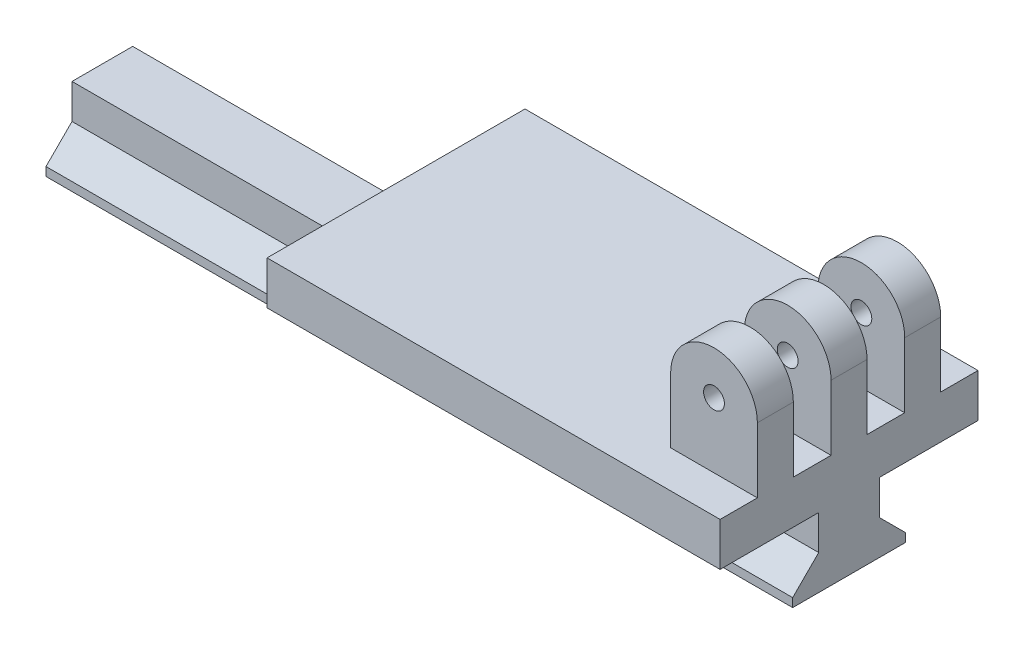
ISO-10303-21;
HEADER;
FILE_DESCRIPTION(('STEP AP214'),'2;1');
FILE_NAME('part.step','',(''),(''),'','','');
FILE_SCHEMA(('AUTOMOTIVE_DESIGN { 1 0 10303 214 1 1 1 1 }'));
ENDSEC;
DATA;
#1=APPLICATION_CONTEXT('core data for automotive mechanical design processes');
#2=APPLICATION_PROTOCOL_DEFINITION('international standard','automotive_design',2000,#1);
#3=PRODUCT_CONTEXT('',#1,'mechanical');
#4=PRODUCT('Part','Part','',(#3));
#5=PRODUCT_RELATED_PRODUCT_CATEGORY('part','',(#4));
#6=PRODUCT_DEFINITION_FORMATION('','',#4);
#7=PRODUCT_DEFINITION_CONTEXT('part definition',#1,'design');
#8=PRODUCT_DEFINITION('design','',#6,#7);
#9=PRODUCT_DEFINITION_SHAPE('','',#8);
#10=(LENGTH_UNIT() NAMED_UNIT(*) SI_UNIT(.MILLI.,.METRE.));
#11=(NAMED_UNIT(*) PLANE_ANGLE_UNIT() SI_UNIT($,.RADIAN.));
#12=(NAMED_UNIT(*) SI_UNIT($,.STERADIAN.) SOLID_ANGLE_UNIT());
#13=UNCERTAINTY_MEASURE_WITH_UNIT(LENGTH_MEASURE(1.E-05),#10,'distance_accuracy_value','');
#14=(GEOMETRIC_REPRESENTATION_CONTEXT(3) GLOBAL_UNCERTAINTY_ASSIGNED_CONTEXT((#13)) GLOBAL_UNIT_ASSIGNED_CONTEXT((#10,
#11,#12)) REPRESENTATION_CONTEXT('',''));
#15=CARTESIAN_POINT('',(0.,0.,0.));
#16=DIRECTION('',(0.,0.,1.));
#17=DIRECTION('',(1.,0.,0.));
#18=AXIS2_PLACEMENT_3D('',#15,#16,#17);
#19=CARTESIAN_POINT('',(0.,0.,0.));
#20=DIRECTION('',(0.,1.,0.));
#21=DIRECTION('',(0.,0.,1.));
#22=AXIS2_PLACEMENT_3D('',#19,#20,#21);
#23=PLANE('',#22);
#24=DIRECTION('',(1.,0.,0.));
#25=VECTOR('',#24,1.);
#26=CARTESIAN_POINT('',(-120.,0.,-7.));
#27=LINE('',#26,#25);
#28=CARTESIAN_POINT('',(-52.25,0.,-7.));
#29=VERTEX_POINT('',#28);
#30=CARTESIAN_POINT('',(52.25,0.,-7.));
#31=VERTEX_POINT('',#30);
#32=EDGE_CURVE('E50',#29,#31,#27,.T.);
#33=ORIENTED_EDGE('',*,*,#32,.F.);
#34=DIRECTION('',(0.,0.,1.));
#35=VECTOR('',#34,1.);
#36=CARTESIAN_POINT('',(-52.25,0.,-29.75));
#37=LINE('',#36,#35);
#38=CARTESIAN_POINT('',(-52.25,0.,-29.75));
#39=VERTEX_POINT('',#38);
#40=EDGE_CURVE('E372',#39,#29,#37,.T.);
#41=ORIENTED_EDGE('',*,*,#40,.F.);
#42=DIRECTION('',(-1.,0.,0.));
#43=VECTOR('',#42,1.);
#44=CARTESIAN_POINT('',(-52.25,0.,-29.75));
#45=LINE('',#44,#43);
#46=CARTESIAN_POINT('',(52.25,0.,-29.75));
#47=VERTEX_POINT('',#46);
#48=EDGE_CURVE('E369',#47,#39,#45,.T.);
#49=ORIENTED_EDGE('',*,*,#48,.F.);
#50=DIRECTION('',(0.,0.,-1.));
#51=VECTOR('',#50,1.);
#52=CARTESIAN_POINT('',(52.25,0.,-29.75));
#53=LINE('',#52,#51);
#54=EDGE_CURVE('E370',#31,#47,#53,.T.);
#55=ORIENTED_EDGE('',*,*,#54,.F.);
#56=EDGE_LOOP('',(#33,#41,#49,#55));
#57=FACE_BOUND('',#56,.T.);
#58=ADVANCED_FACE('F41',(#57),#23,.F.);
#59=CARTESIAN_POINT('',(52.25,10.,-29.75));
#60=DIRECTION('',(-1.,0.,0.));
#61=DIRECTION('',(0.,0.,1.));
#62=AXIS2_PLACEMENT_3D('',#59,#60,#61);
#63=PLANE('',#62);
#64=DIRECTION('',(0.,-1.,0.));
#65=VECTOR('',#64,1.);
#66=CARTESIAN_POINT('',(52.25,35.,-21.15));
#67=LINE('',#66,#65);
#68=CARTESIAN_POINT('',(52.25,25.,-21.15));
#69=VERTEX_POINT('',#68);
#70=CARTESIAN_POINT('',(52.25,10.,-21.15));
#71=VERTEX_POINT('',#70);
#72=EDGE_CURVE('E294',#69,#71,#67,.T.);
#73=ORIENTED_EDGE('',*,*,#72,.F.);
#74=DIRECTION('',(0.,0.,-1.));
#75=VECTOR('',#74,1.);
#76=CARTESIAN_POINT('',(52.25,25.,61.7656211871642));
#77=LINE('',#76,#75);
#78=CARTESIAN_POINT('',(52.25,25.,-12.85));
#79=VERTEX_POINT('',#78);
#80=EDGE_CURVE('E353',#79,#69,#77,.T.);
#81=ORIENTED_EDGE('',*,*,#80,.F.);
#82=DIRECTION('',(0.,-1.,0.));
#83=VECTOR('',#82,1.);
#84=CARTESIAN_POINT('',(52.25,35.,-12.85));
#85=LINE('',#84,#83);
#86=CARTESIAN_POINT('',(52.25,10.,-12.85));
#87=VERTEX_POINT('',#86);
#88=EDGE_CURVE('E306',#79,#87,#85,.T.);
#89=ORIENTED_EDGE('',*,*,#88,.T.);
#90=DIRECTION('',(0.,0.,-1.));
#91=VECTOR('',#90,1.);
#92=CARTESIAN_POINT('',(52.25,10.,-12.85));
#93=LINE('',#92,#91);
#94=CARTESIAN_POINT('',(52.25,10.,-4.15));
#95=VERTEX_POINT('',#94);
#96=EDGE_CURVE('E314',#95,#87,#93,.T.);
#97=ORIENTED_EDGE('',*,*,#96,.F.);
#98=DIRECTION('',(0.,-1.,0.));
#99=VECTOR('',#98,1.);
#100=CARTESIAN_POINT('',(52.25,35.,-4.15));
#101=LINE('',#100,#99);
#102=CARTESIAN_POINT('',(52.25,25.,-4.15));
#103=VERTEX_POINT('',#102);
#104=EDGE_CURVE('E303',#103,#95,#101,.T.);
#105=ORIENTED_EDGE('',*,*,#104,.F.);
#106=CARTESIAN_POINT('',(52.25,25.,4.15));
#107=VERTEX_POINT('',#106);
#108=EDGE_CURVE('E356',#107,#103,#77,.T.);
#109=ORIENTED_EDGE('',*,*,#108,.F.);
#110=DIRECTION('',(0.,-1.,0.));
#111=VECTOR('',#110,1.);
#112=CARTESIAN_POINT('',(52.25,35.,4.15));
#113=LINE('',#112,#111);
#114=CARTESIAN_POINT('',(52.25,10.,4.15));
#115=VERTEX_POINT('',#114);
#116=EDGE_CURVE('E324',#107,#115,#113,.T.);
#117=ORIENTED_EDGE('',*,*,#116,.T.);
#118=DIRECTION('',(0.,0.,-1.));
#119=VECTOR('',#118,1.);
#120=CARTESIAN_POINT('',(52.25,10.,4.15));
#121=LINE('',#120,#119);
#122=CARTESIAN_POINT('',(52.25,10.,12.85));
#123=VERTEX_POINT('',#122);
#124=EDGE_CURVE('E332',#123,#115,#121,.T.);
#125=ORIENTED_EDGE('',*,*,#124,.F.);
#126=DIRECTION('',(0.,-1.,0.));
#127=VECTOR('',#126,1.);
#128=CARTESIAN_POINT('',(52.25,35.,12.85));
#129=LINE('',#128,#127);
#130=CARTESIAN_POINT('',(52.25,25.,12.85));
#131=VERTEX_POINT('',#130);
#132=EDGE_CURVE('E321',#131,#123,#129,.T.);
#133=ORIENTED_EDGE('',*,*,#132,.F.);
#134=CARTESIAN_POINT('',(52.25,25.,21.15));
#135=VERTEX_POINT('',#134);
#136=EDGE_CURVE('E357',#135,#131,#77,.T.);
#137=ORIENTED_EDGE('',*,*,#136,.F.);
#138=DIRECTION('',(0.,-1.,0.));
#139=VECTOR('',#138,1.);
#140=CARTESIAN_POINT('',(52.25,35.,21.15));
#141=LINE('',#140,#139);
#142=CARTESIAN_POINT('',(52.25,10.,21.15));
#143=VERTEX_POINT('',#142);
#144=EDGE_CURVE('E286',#135,#143,#141,.T.);
#145=ORIENTED_EDGE('',*,*,#144,.T.);
#146=DIRECTION('',(0.,0.,-1.));
#147=VECTOR('',#146,1.);
#148=CARTESIAN_POINT('',(52.25,10.,21.15));
#149=LINE('',#148,#147);
#150=CARTESIAN_POINT('',(52.25,10.,29.75));
#151=VERTEX_POINT('',#150);
#152=EDGE_CURVE('E322',#151,#143,#149,.T.);
#153=ORIENTED_EDGE('',*,*,#152,.F.);
#154=DIRECTION('',(0.,-1.,0.));
#155=VECTOR('',#154,1.);
#156=CARTESIAN_POINT('',(52.25,10.,29.75));
#157=LINE('',#156,#155);
#158=CARTESIAN_POINT('',(52.25,0.,29.75));
#159=VERTEX_POINT('',#158);
#160=EDGE_CURVE('E365',#151,#159,#157,.T.);
#161=ORIENTED_EDGE('',*,*,#160,.T.);
#162=CARTESIAN_POINT('',(52.25,0.,7.));
#163=VERTEX_POINT('',#162);
#164=EDGE_CURVE('E366',#159,#163,#53,.T.);
#165=ORIENTED_EDGE('',*,*,#164,.T.);
#166=DIRECTION('',(0.,1.,0.));
#167=VECTOR('',#166,1.);
#168=CARTESIAN_POINT('',(52.25,0.,7.));
#169=LINE('',#168,#167);
#170=CARTESIAN_POINT('',(52.25,-8.,7.));
#171=VERTEX_POINT('',#170);
#172=EDGE_CURVE('E237',#171,#163,#169,.T.);
#173=ORIENTED_EDGE('',*,*,#172,.F.);
#174=DIRECTION('',(0.,0.707106781186548,-0.707106781186547));
#175=VECTOR('',#174,1.);
#176=CARTESIAN_POINT('',(52.25,-8.,7.));
#177=LINE('',#176,#175);
#178=CARTESIAN_POINT('',(52.25,-14.,13.));
#179=VERTEX_POINT('',#178);
#180=EDGE_CURVE('E748',#179,#171,#177,.T.);
#181=ORIENTED_EDGE('',*,*,#180,.F.);
#182=DIRECTION('',(0.,1.,0.));
#183=VECTOR('',#182,1.);
#184=CARTESIAN_POINT('',(52.25,-14.,13.));
#185=LINE('',#184,#183);
#186=CARTESIAN_POINT('',(52.25,-16.,13.));
#187=VERTEX_POINT('',#186);
#188=EDGE_CURVE('E751',#187,#179,#185,.T.);
#189=ORIENTED_EDGE('',*,*,#188,.F.);
#190=DIRECTION('',(0.,0.,1.));
#191=VECTOR('',#190,1.);
#192=CARTESIAN_POINT('',(52.25,-16.,13.));
#193=LINE('',#192,#191);
#194=CARTESIAN_POINT('',(52.25,-16.,-13.));
#195=VERTEX_POINT('',#194);
#196=EDGE_CURVE('E753',#195,#187,#193,.T.);
#197=ORIENTED_EDGE('',*,*,#196,.F.);
#198=DIRECTION('',(0.,-1.,0.));
#199=VECTOR('',#198,1.);
#200=CARTESIAN_POINT('',(52.25,-16.,-13.));
#201=LINE('',#200,#199);
#202=CARTESIAN_POINT('',(52.25,-14.,-13.));
#203=VERTEX_POINT('',#202);
#204=EDGE_CURVE('E230',#203,#195,#201,.T.);
#205=ORIENTED_EDGE('',*,*,#204,.F.);
#206=DIRECTION('',(0.,-0.707106781186548,-0.707106781186547));
#207=VECTOR('',#206,1.);
#208=CARTESIAN_POINT('',(52.25,-14.,-13.));
#209=LINE('',#208,#207);
#210=CARTESIAN_POINT('',(52.25,-8.,-7.));
#211=VERTEX_POINT('',#210);
#212=EDGE_CURVE('E213',#211,#203,#209,.T.);
#213=ORIENTED_EDGE('',*,*,#212,.F.);
#214=DIRECTION('',(0.,-1.,0.));
#215=VECTOR('',#214,1.);
#216=CARTESIAN_POINT('',(52.25,-8.,-7.));
#217=LINE('',#216,#215);
#218=EDGE_CURVE('E227',#31,#211,#217,.T.);
#219=ORIENTED_EDGE('',*,*,#218,.F.);
#220=ORIENTED_EDGE('',*,*,#54,.T.);
#221=DIRECTION('',(0.,-1.,0.));
#222=VECTOR('',#221,1.);
#223=CARTESIAN_POINT('',(52.25,10.,-29.75));
#224=LINE('',#223,#222);
#225=CARTESIAN_POINT('',(52.25,10.,-29.75));
#226=VERTEX_POINT('',#225);
#227=EDGE_CURVE('E384',#226,#47,#224,.T.);
#228=ORIENTED_EDGE('',*,*,#227,.F.);
#229=DIRECTION('',(0.,0.,-1.));
#230=VECTOR('',#229,1.);
#231=CARTESIAN_POINT('',(52.25,10.,-29.75));
#232=LINE('',#231,#230);
#233=EDGE_CURVE('E290',#71,#226,#232,.T.);
#234=ORIENTED_EDGE('',*,*,#233,.F.);
#235=EDGE_LOOP('',(#73,#81,#89,#97,#105,#109,#117,#125,#133,#137,#145,#153,#161,#165,#173,#181,
#189,#197,#205,#213,#219,#220,#228,#234));
#236=FACE_BOUND('',#235,.T.);
#237=ADVANCED_FACE('F43',(#236),#63,.F.);
#238=CARTESIAN_POINT('',(-52.25,10.,-29.75));
#239=DIRECTION('',(0.,0.,1.));
#240=DIRECTION('',(1.,0.,0.));
#241=AXIS2_PLACEMENT_3D('',#238,#239,#240);
#242=PLANE('',#241);
#243=DIRECTION('',(-1.,0.,0.));
#244=VECTOR('',#243,1.);
#245=CARTESIAN_POINT('',(-52.25,10.,-29.75));
#246=LINE('',#245,#244);
#247=CARTESIAN_POINT('',(-52.25,10.,-29.75));
#248=VERTEX_POINT('',#247);
#249=EDGE_CURVE('E358',#226,#248,#246,.T.);
#250=ORIENTED_EDGE('',*,*,#249,.F.);
#251=ORIENTED_EDGE('',*,*,#227,.T.);
#252=ORIENTED_EDGE('',*,*,#48,.T.);
#253=DIRECTION('',(0.,-1.,0.));
#254=VECTOR('',#253,1.);
#255=CARTESIAN_POINT('',(-52.25,10.,-29.75));
#256=LINE('',#255,#254);
#257=EDGE_CURVE('E381',#248,#39,#256,.T.);
#258=ORIENTED_EDGE('',*,*,#257,.F.);
#259=EDGE_LOOP('',(#250,#251,#252,#258));
#260=FACE_BOUND('',#259,.T.);
#261=ADVANCED_FACE('F453',(#260),#242,.F.);
#262=CARTESIAN_POINT('',(-52.25,10.,29.75));
#263=DIRECTION('',(0.,0.,-1.));
#264=DIRECTION('',(-1.,0.,0.));
#265=AXIS2_PLACEMENT_3D('',#262,#263,#264);
#266=PLANE('',#265);
#267=ORIENTED_EDGE('',*,*,#160,.F.);
#268=DIRECTION('',(1.,0.,0.));
#269=VECTOR('',#268,1.);
#270=CARTESIAN_POINT('',(-52.25,10.,29.75));
#271=LINE('',#270,#269);
#272=CARTESIAN_POINT('',(-52.25,10.,29.75));
#273=VERTEX_POINT('',#272);
#274=EDGE_CURVE('E363',#273,#151,#271,.T.);
#275=ORIENTED_EDGE('',*,*,#274,.F.);
#276=DIRECTION('',(0.,-1.,0.));
#277=VECTOR('',#276,1.);
#278=CARTESIAN_POINT('',(-52.25,10.,29.75));
#279=LINE('',#278,#277);
#280=CARTESIAN_POINT('',(-52.25,0.,29.75));
#281=VERTEX_POINT('',#280);
#282=EDGE_CURVE('E378',#273,#281,#279,.T.);
#283=ORIENTED_EDGE('',*,*,#282,.T.);
#284=DIRECTION('',(1.,0.,0.));
#285=VECTOR('',#284,1.);
#286=CARTESIAN_POINT('',(-52.25,0.,29.75));
#287=LINE('',#286,#285);
#288=EDGE_CURVE('E361',#281,#159,#287,.T.);
#289=ORIENTED_EDGE('',*,*,#288,.T.);
#290=EDGE_LOOP('',(#267,#275,#283,#289));
#291=FACE_BOUND('',#290,.T.);
#292=ADVANCED_FACE('F481',(#291),#266,.F.);
#293=CARTESIAN_POINT('',(32.25,10.,61.7656211871642));
#294=DIRECTION('',(1.,0.,0.));
#295=DIRECTION('',(0.,1.,0.));
#296=AXIS2_PLACEMENT_3D('',#293,#294,#295);
#297=PLANE('',#296);
#298=DIRECTION('',(0.,-1.,0.));
#299=VECTOR('',#298,1.);
#300=CARTESIAN_POINT('',(32.25,35.,-21.15));
#301=LINE('',#300,#299);
#302=CARTESIAN_POINT('',(32.25,25.,-21.15));
#303=VERTEX_POINT('',#302);
#304=CARTESIAN_POINT('',(32.25,10.,-21.15));
#305=VERTEX_POINT('',#304);
#306=EDGE_CURVE('E296',#303,#305,#301,.T.);
#307=ORIENTED_EDGE('',*,*,#306,.T.);
#308=DIRECTION('',(0.,0.,-1.));
#309=VECTOR('',#308,1.);
#310=CARTESIAN_POINT('',(32.25,10.,61.7656211871642));
#311=LINE('',#310,#309);
#312=CARTESIAN_POINT('',(32.25,10.,-12.85));
#313=VERTEX_POINT('',#312);
#314=EDGE_CURVE('E299',#313,#305,#311,.T.);
#315=ORIENTED_EDGE('',*,*,#314,.F.);
#316=DIRECTION('',(0.,-1.,0.));
#317=VECTOR('',#316,1.);
#318=CARTESIAN_POINT('',(32.25,35.,-12.85));
#319=LINE('',#318,#317);
#320=CARTESIAN_POINT('',(32.25,25.,-12.85));
#321=VERTEX_POINT('',#320);
#322=EDGE_CURVE('E309',#321,#313,#319,.T.);
#323=ORIENTED_EDGE('',*,*,#322,.F.);
#324=DIRECTION('',(0.,0.,-1.));
#325=VECTOR('',#324,1.);
#326=CARTESIAN_POINT('',(32.25,25.,61.7656211871642));
#327=LINE('',#326,#325);
#328=EDGE_CURVE('E348',#321,#303,#327,.T.);
#329=ORIENTED_EDGE('',*,*,#328,.T.);
#330=EDGE_LOOP('',(#307,#315,#323,#329));
#331=FACE_BOUND('',#330,.T.);
#332=ADVANCED_FACE('F484',(#331),#297,.F.);
#333=DIRECTION('',(0.,-1.,0.));
#334=VECTOR('',#333,1.);
#335=CARTESIAN_POINT('',(32.25,35.,-4.15));
#336=LINE('',#335,#334);
#337=CARTESIAN_POINT('',(32.25,25.,-4.15));
#338=VERTEX_POINT('',#337);
#339=CARTESIAN_POINT('',(32.25,10.,-4.15));
#340=VERTEX_POINT('',#339);
#341=EDGE_CURVE('E300',#338,#340,#336,.T.);
#342=ORIENTED_EDGE('',*,*,#341,.T.);
#343=CARTESIAN_POINT('',(32.25,10.,4.15));
#344=VERTEX_POINT('',#343);
#345=EDGE_CURVE('E346',#344,#340,#311,.T.);
#346=ORIENTED_EDGE('',*,*,#345,.F.);
#347=DIRECTION('',(0.,-1.,0.));
#348=VECTOR('',#347,1.);
#349=CARTESIAN_POINT('',(32.25,35.,4.15));
#350=LINE('',#349,#348);
#351=CARTESIAN_POINT('',(32.25,25.,4.15));
#352=VERTEX_POINT('',#351);
#353=EDGE_CURVE('E327',#352,#344,#350,.T.);
#354=ORIENTED_EDGE('',*,*,#353,.F.);
#355=EDGE_CURVE('E351',#352,#338,#327,.T.);
#356=ORIENTED_EDGE('',*,*,#355,.T.);
#357=EDGE_LOOP('',(#342,#346,#354,#356));
#358=FACE_BOUND('',#357,.T.);
#359=ADVANCED_FACE('F425',(#358),#297,.F.);
#360=DIRECTION('',(0.,-1.,0.));
#361=VECTOR('',#360,1.);
#362=CARTESIAN_POINT('',(32.25,35.,12.85));
#363=LINE('',#362,#361);
#364=CARTESIAN_POINT('',(32.25,25.,12.85));
#365=VERTEX_POINT('',#364);
#366=CARTESIAN_POINT('',(32.25,10.,12.85));
#367=VERTEX_POINT('',#366);
#368=EDGE_CURVE('E318',#365,#367,#363,.T.);
#369=ORIENTED_EDGE('',*,*,#368,.T.);
#370=CARTESIAN_POINT('',(32.25,10.,21.15));
#371=VERTEX_POINT('',#370);
#372=EDGE_CURVE('E347',#371,#367,#311,.T.);
#373=ORIENTED_EDGE('',*,*,#372,.F.);
#374=DIRECTION('',(0.,-1.,0.));
#375=VECTOR('',#374,1.);
#376=CARTESIAN_POINT('',(32.25,35.,21.15));
#377=LINE('',#376,#375);
#378=CARTESIAN_POINT('',(32.25,25.,21.15));
#379=VERTEX_POINT('',#378);
#380=EDGE_CURVE('E338',#379,#371,#377,.T.);
#381=ORIENTED_EDGE('',*,*,#380,.F.);
#382=EDGE_CURVE('E352',#379,#365,#327,.T.);
#383=ORIENTED_EDGE('',*,*,#382,.T.);
#384=EDGE_LOOP('',(#369,#373,#381,#383));
#385=FACE_BOUND('',#384,.T.);
#386=ADVANCED_FACE('F433',(#385),#297,.F.);
#387=CARTESIAN_POINT('',(42.25,25.,61.7656211871642));
#388=DIRECTION('',(0.,0.,-1.));
#389=DIRECTION('',(-1.,0.,0.));
#390=AXIS2_PLACEMENT_3D('',#387,#388,#389);
#391=CYLINDRICAL_SURFACE('',#390,10.);
#392=CARTESIAN_POINT('',(42.25,25.,-21.15));
#393=DIRECTION('',(0.,0.,-1.));
#394=DIRECTION('',(-1.,0.,0.));
#395=AXIS2_PLACEMENT_3D('',#392,#393,#394);
#396=CIRCLE('',#395,10.);
#397=EDGE_CURVE('E396',#303,#69,#396,.T.);
#398=ORIENTED_EDGE('',*,*,#397,.F.);
#399=ORIENTED_EDGE('',*,*,#328,.F.);
#400=CARTESIAN_POINT('',(42.25,25.,-12.85));
#401=DIRECTION('',(0.,0.,1.));
#402=DIRECTION('',(1.,0.,0.));
#403=AXIS2_PLACEMENT_3D('',#400,#401,#402);
#404=CIRCLE('',#403,10.);
#405=EDGE_CURVE('E393',#79,#321,#404,.T.);
#406=ORIENTED_EDGE('',*,*,#405,.F.);
#407=ORIENTED_EDGE('',*,*,#80,.T.);
#408=EDGE_LOOP('',(#398,#399,#406,#407));
#409=FACE_BOUND('',#408,.T.);
#410=ADVANCED_FACE('F405',(#409),#391,.T.);
#411=CARTESIAN_POINT('',(42.25,25.,-4.15));
#412=DIRECTION('',(0.,0.,-1.));
#413=DIRECTION('',(-1.,0.,0.));
#414=AXIS2_PLACEMENT_3D('',#411,#412,#413);
#415=CIRCLE('',#414,10.);
#416=EDGE_CURVE('E395',#338,#103,#415,.T.);
#417=ORIENTED_EDGE('',*,*,#416,.F.);
#418=ORIENTED_EDGE('',*,*,#355,.F.);
#419=CARTESIAN_POINT('',(42.25,25.,4.15));
#420=DIRECTION('',(0.,0.,1.));
#421=DIRECTION('',(1.,0.,0.));
#422=AXIS2_PLACEMENT_3D('',#419,#420,#421);
#423=CIRCLE('',#422,10.);
#424=EDGE_CURVE('E389',#107,#352,#423,.T.);
#425=ORIENTED_EDGE('',*,*,#424,.F.);
#426=ORIENTED_EDGE('',*,*,#108,.T.);
#427=EDGE_LOOP('',(#417,#418,#425,#426));
#428=FACE_BOUND('',#427,.T.);
#429=ADVANCED_FACE('F450',(#428),#391,.T.);
#430=CARTESIAN_POINT('',(42.25,25.,12.85));
#431=DIRECTION('',(0.,0.,-1.));
#432=DIRECTION('',(-1.,0.,0.));
#433=AXIS2_PLACEMENT_3D('',#430,#431,#432);
#434=CIRCLE('',#433,10.);
#435=EDGE_CURVE('E391',#365,#131,#434,.T.);
#436=ORIENTED_EDGE('',*,*,#435,.F.);
#437=ORIENTED_EDGE('',*,*,#382,.F.);
#438=CARTESIAN_POINT('',(42.25,25.,21.15));
#439=DIRECTION('',(0.,0.,1.));
#440=DIRECTION('',(1.,0.,0.));
#441=AXIS2_PLACEMENT_3D('',#438,#439,#440);
#442=CIRCLE('',#441,10.);
#443=EDGE_CURVE('E387',#135,#379,#442,.T.);
#444=ORIENTED_EDGE('',*,*,#443,.F.);
#445=ORIENTED_EDGE('',*,*,#136,.T.);
#446=EDGE_LOOP('',(#436,#437,#444,#445));
#447=FACE_BOUND('',#446,.T.);
#448=ADVANCED_FACE('F438',(#447),#391,.T.);
#449=CARTESIAN_POINT('',(0.,10.,0.));
#450=DIRECTION('',(0.,1.,0.));
#451=DIRECTION('',(0.,0.,1.));
#452=AXIS2_PLACEMENT_3D('',#449,#450,#451);
#453=PLANE('',#452);
#454=ORIENTED_EDGE('',*,*,#274,.T.);
#455=ORIENTED_EDGE('',*,*,#152,.T.);
#456=DIRECTION('',(-1.,0.,0.));
#457=VECTOR('',#456,1.);
#458=CARTESIAN_POINT('',(32.25,10.,21.15));
#459=LINE('',#458,#457);
#460=EDGE_CURVE('E340',#143,#371,#459,.T.);
#461=ORIENTED_EDGE('',*,*,#460,.T.);
#462=ORIENTED_EDGE('',*,*,#372,.T.);
#463=DIRECTION('',(1.,0.,0.));
#464=VECTOR('',#463,1.);
#465=CARTESIAN_POINT('',(32.25,10.,12.85));
#466=LINE('',#465,#464);
#467=EDGE_CURVE('E304',#367,#123,#466,.T.);
#468=ORIENTED_EDGE('',*,*,#467,.T.);
#469=ORIENTED_EDGE('',*,*,#124,.T.);
#470=DIRECTION('',(-1.,0.,0.));
#471=VECTOR('',#470,1.);
#472=CARTESIAN_POINT('',(32.25,10.,4.15));
#473=LINE('',#472,#471);
#474=EDGE_CURVE('E329',#115,#344,#473,.T.);
#475=ORIENTED_EDGE('',*,*,#474,.T.);
#476=ORIENTED_EDGE('',*,*,#345,.T.);
#477=DIRECTION('',(1.,0.,0.));
#478=VECTOR('',#477,1.);
#479=CARTESIAN_POINT('',(32.25,10.,-4.15));
#480=LINE('',#479,#478);
#481=EDGE_CURVE('E291',#340,#95,#480,.T.);
#482=ORIENTED_EDGE('',*,*,#481,.T.);
#483=ORIENTED_EDGE('',*,*,#96,.T.);
#484=DIRECTION('',(-1.,0.,0.));
#485=VECTOR('',#484,1.);
#486=CARTESIAN_POINT('',(32.25,10.,-12.85));
#487=LINE('',#486,#485);
#488=EDGE_CURVE('E311',#87,#313,#487,.T.);
#489=ORIENTED_EDGE('',*,*,#488,.T.);
#490=ORIENTED_EDGE('',*,*,#314,.T.);
#491=DIRECTION('',(1.,0.,0.));
#492=VECTOR('',#491,1.);
#493=CARTESIAN_POINT('',(32.25,10.,-21.15));
#494=LINE('',#493,#492);
#495=EDGE_CURVE('E287',#305,#71,#494,.T.);
#496=ORIENTED_EDGE('',*,*,#495,.T.);
#497=ORIENTED_EDGE('',*,*,#233,.T.);
#498=ORIENTED_EDGE('',*,*,#249,.T.);
#499=DIRECTION('',(0.,0.,1.));
#500=VECTOR('',#499,1.);
#501=CARTESIAN_POINT('',(-52.25,10.,-29.75));
#502=LINE('',#501,#500);
#503=EDGE_CURVE('E360',#248,#273,#502,.T.);
#504=ORIENTED_EDGE('',*,*,#503,.T.);
#505=EDGE_LOOP('',(#454,#455,#461,#462,#468,#469,#475,#476,#482,#483,#489,#490,#496,#497,#498,#504));
#506=FACE_BOUND('',#505,.T.);
#507=ADVANCED_FACE('F416',(#506),#453,.T.);
#508=CARTESIAN_POINT('',(-52.25,10.,-29.75));
#509=DIRECTION('',(1.,0.,0.));
#510=DIRECTION('',(0.,0.,-1.));
#511=AXIS2_PLACEMENT_3D('',#508,#509,#510);
#512=PLANE('',#511);
#513=ORIENTED_EDGE('',*,*,#40,.T.);
#514=CARTESIAN_POINT('',(-52.25,0.,7.));
#515=VERTEX_POINT('',#514);
#516=EDGE_CURVE('E374',#29,#515,#37,.T.);
#517=ORIENTED_EDGE('',*,*,#516,.T.);
#518=EDGE_CURVE('E58',#515,#281,#37,.T.);
#519=ORIENTED_EDGE('',*,*,#518,.T.);
#520=ORIENTED_EDGE('',*,*,#282,.F.);
#521=ORIENTED_EDGE('',*,*,#503,.F.);
#522=ORIENTED_EDGE('',*,*,#257,.T.);
#523=EDGE_LOOP('',(#513,#517,#519,#520,#521,#522));
#524=FACE_BOUND('',#523,.T.);
#525=ADVANCED_FACE('F457',(#524),#512,.F.);
#526=ORIENTED_EDGE('',*,*,#518,.F.);
#527=DIRECTION('',(1.,0.,0.));
#528=VECTOR('',#527,1.);
#529=CARTESIAN_POINT('',(-120.,0.,7.));
#530=LINE('',#529,#528);
#531=EDGE_CURVE('E11',#515,#163,#530,.T.);
#532=ORIENTED_EDGE('',*,*,#531,.T.);
#533=ORIENTED_EDGE('',*,*,#164,.F.);
#534=ORIENTED_EDGE('',*,*,#288,.F.);
#535=EDGE_LOOP('',(#526,#532,#533,#534));
#536=FACE_BOUND('',#535,.T.);
#537=ADVANCED_FACE('F474',(#536),#23,.F.);
#538=CARTESIAN_POINT('',(32.25,35.,21.15));
#539=DIRECTION('',(0.,0.,1.));
#540=DIRECTION('',(1.,0.,0.));
#541=AXIS2_PLACEMENT_3D('',#538,#539,#540);
#542=PLANE('',#541);
#543=CARTESIAN_POINT('',(42.25,25.,21.15));
#544=DIRECTION('',(0.,0.,1.));
#545=DIRECTION('',(1.,0.,0.));
#546=AXIS2_PLACEMENT_3D('',#543,#544,#545);
#547=CIRCLE('',#546,2.39999999999999);
#548=CARTESIAN_POINT('',(44.65,25.,21.15));
#549=VERTEX_POINT('',#548);
#550=EDGE_CURVE('E283',#549,#549,#547,.T.);
#551=ORIENTED_EDGE('',*,*,#550,.F.);
#552=EDGE_LOOP('',(#551));
#553=FACE_BOUND('',#552,.T.);
#554=ORIENTED_EDGE('',*,*,#144,.F.);
#555=ORIENTED_EDGE('',*,*,#443,.T.);
#556=ORIENTED_EDGE('',*,*,#380,.T.);
#557=ORIENTED_EDGE('',*,*,#460,.F.);
#558=EDGE_LOOP('',(#554,#555,#556,#557));
#559=FACE_BOUND('',#558,.T.);
#560=ADVANCED_FACE('F503',(#553,#559),#542,.T.);
#561=CARTESIAN_POINT('',(32.25,35.,12.85));
#562=DIRECTION('',(0.,0.,-1.));
#563=DIRECTION('',(-1.,0.,0.));
#564=AXIS2_PLACEMENT_3D('',#561,#562,#563);
#565=PLANE('',#564);
#566=CARTESIAN_POINT('',(42.25,25.,12.85));
#567=DIRECTION('',(0.,0.,-1.));
#568=DIRECTION('',(-1.,0.,0.));
#569=AXIS2_PLACEMENT_3D('',#566,#567,#568);
#570=CIRCLE('',#569,2.39999999999999);
#571=CARTESIAN_POINT('',(39.85,25.,12.85));
#572=VERTEX_POINT('',#571);
#573=EDGE_CURVE('E280',#572,#572,#570,.T.);
#574=ORIENTED_EDGE('',*,*,#573,.F.);
#575=EDGE_LOOP('',(#574));
#576=FACE_BOUND('',#575,.T.);
#577=ORIENTED_EDGE('',*,*,#368,.F.);
#578=ORIENTED_EDGE('',*,*,#435,.T.);
#579=ORIENTED_EDGE('',*,*,#132,.T.);
#580=ORIENTED_EDGE('',*,*,#467,.F.);
#581=EDGE_LOOP('',(#577,#578,#579,#580));
#582=FACE_BOUND('',#581,.T.);
#583=ADVANCED_FACE('F444',(#576,#582),#565,.T.);
#584=CARTESIAN_POINT('',(32.25,35.,4.15));
#585=DIRECTION('',(0.,0.,1.));
#586=DIRECTION('',(1.,0.,0.));
#587=AXIS2_PLACEMENT_3D('',#584,#585,#586);
#588=PLANE('',#587);
#589=CARTESIAN_POINT('',(42.25,25.,4.15));
#590=DIRECTION('',(0.,0.,1.));
#591=DIRECTION('',(1.,0.,0.));
#592=AXIS2_PLACEMENT_3D('',#589,#590,#591);
#593=CIRCLE('',#592,2.39999999999999);
#594=CARTESIAN_POINT('',(44.65,25.,4.15));
#595=VERTEX_POINT('',#594);
#596=EDGE_CURVE('E277',#595,#595,#593,.T.);
#597=ORIENTED_EDGE('',*,*,#596,.F.);
#598=EDGE_LOOP('',(#597));
#599=FACE_BOUND('',#598,.T.);
#600=ORIENTED_EDGE('',*,*,#116,.F.);
#601=ORIENTED_EDGE('',*,*,#424,.T.);
#602=ORIENTED_EDGE('',*,*,#353,.T.);
#603=ORIENTED_EDGE('',*,*,#474,.F.);
#604=EDGE_LOOP('',(#600,#601,#602,#603));
#605=FACE_BOUND('',#604,.T.);
#606=ADVANCED_FACE('F449',(#599,#605),#588,.T.);
#607=CARTESIAN_POINT('',(32.25,35.,-4.15));
#608=DIRECTION('',(0.,0.,-1.));
#609=DIRECTION('',(-1.,0.,0.));
#610=AXIS2_PLACEMENT_3D('',#607,#608,#609);
#611=PLANE('',#610);
#612=CARTESIAN_POINT('',(42.25,25.,-4.15));
#613=DIRECTION('',(0.,0.,-1.));
#614=DIRECTION('',(-1.,0.,0.));
#615=AXIS2_PLACEMENT_3D('',#612,#613,#614);
#616=CIRCLE('',#615,2.39999999999999);
#617=CARTESIAN_POINT('',(39.85,25.,-4.15));
#618=VERTEX_POINT('',#617);
#619=EDGE_CURVE('E274',#618,#618,#616,.T.);
#620=ORIENTED_EDGE('',*,*,#619,.F.);
#621=EDGE_LOOP('',(#620));
#622=FACE_BOUND('',#621,.T.);
#623=ORIENTED_EDGE('',*,*,#341,.F.);
#624=ORIENTED_EDGE('',*,*,#416,.T.);
#625=ORIENTED_EDGE('',*,*,#104,.T.);
#626=ORIENTED_EDGE('',*,*,#481,.F.);
#627=EDGE_LOOP('',(#623,#624,#625,#626));
#628=FACE_BOUND('',#627,.T.);
#629=ADVANCED_FACE('F422',(#622,#628),#611,.T.);
#630=CARTESIAN_POINT('',(32.25,35.,-12.85));
#631=DIRECTION('',(0.,0.,1.));
#632=DIRECTION('',(1.,0.,0.));
#633=AXIS2_PLACEMENT_3D('',#630,#631,#632);
#634=PLANE('',#633);
#635=CARTESIAN_POINT('',(42.25,25.,-12.85));
#636=DIRECTION('',(0.,0.,1.));
#637=DIRECTION('',(1.,0.,0.));
#638=AXIS2_PLACEMENT_3D('',#635,#636,#637);
#639=CIRCLE('',#638,2.39999999999999);
#640=CARTESIAN_POINT('',(44.65,25.,-12.85));
#641=VERTEX_POINT('',#640);
#642=EDGE_CURVE('E271',#641,#641,#639,.T.);
#643=ORIENTED_EDGE('',*,*,#642,.F.);
#644=EDGE_LOOP('',(#643));
#645=FACE_BOUND('',#644,.T.);
#646=ORIENTED_EDGE('',*,*,#88,.F.);
#647=ORIENTED_EDGE('',*,*,#405,.T.);
#648=ORIENTED_EDGE('',*,*,#322,.T.);
#649=ORIENTED_EDGE('',*,*,#488,.F.);
#650=EDGE_LOOP('',(#646,#647,#648,#649));
#651=FACE_BOUND('',#650,.T.);
#652=ADVANCED_FACE('F410',(#645,#651),#634,.T.);
#653=CARTESIAN_POINT('',(32.25,35.,-21.15));
#654=DIRECTION('',(0.,0.,-1.));
#655=DIRECTION('',(-1.,0.,0.));
#656=AXIS2_PLACEMENT_3D('',#653,#654,#655);
#657=PLANE('',#656);
#658=CARTESIAN_POINT('',(42.25,25.,-21.15));
#659=DIRECTION('',(0.,0.,-1.));
#660=DIRECTION('',(-1.,0.,0.));
#661=AXIS2_PLACEMENT_3D('',#658,#659,#660);
#662=CIRCLE('',#661,2.39999999999999);
#663=CARTESIAN_POINT('',(39.85,25.,-21.15));
#664=VERTEX_POINT('',#663);
#665=EDGE_CURVE('E45',#664,#664,#662,.T.);
#666=ORIENTED_EDGE('',*,*,#665,.F.);
#667=EDGE_LOOP('',(#666));
#668=FACE_BOUND('',#667,.T.);
#669=ORIENTED_EDGE('',*,*,#306,.F.);
#670=ORIENTED_EDGE('',*,*,#397,.T.);
#671=ORIENTED_EDGE('',*,*,#72,.T.);
#672=ORIENTED_EDGE('',*,*,#495,.F.);
#673=EDGE_LOOP('',(#669,#670,#671,#672));
#674=FACE_BOUND('',#673,.T.);
#675=ADVANCED_FACE('F399',(#668,#674),#657,.T.);
#676=CARTESIAN_POINT('',(42.25,25.,29.75));
#677=DIRECTION('',(0.,0.,1.));
#678=DIRECTION('',(1.,0.,0.));
#679=AXIS2_PLACEMENT_3D('',#676,#677,#678);
#680=CYLINDRICAL_SURFACE('',#679,2.39999999999999);
#681=ORIENTED_EDGE('',*,*,#642,.T.);
#682=EDGE_LOOP('',(#681));
#683=FACE_BOUND('',#682,.T.);
#684=ORIENTED_EDGE('',*,*,#665,.T.);
#685=EDGE_LOOP('',(#684));
#686=FACE_BOUND('',#685,.T.);
#687=ADVANCED_FACE('F632',(#683,#686),#680,.F.);
#688=ORIENTED_EDGE('',*,*,#596,.T.);
#689=EDGE_LOOP('',(#688));
#690=FACE_BOUND('',#689,.T.);
#691=ORIENTED_EDGE('',*,*,#619,.T.);
#692=EDGE_LOOP('',(#691));
#693=FACE_BOUND('',#692,.T.);
#694=ADVANCED_FACE('F642',(#690,#693),#680,.F.);
#695=ORIENTED_EDGE('',*,*,#550,.T.);
#696=EDGE_LOOP('',(#695));
#697=FACE_BOUND('',#696,.T.);
#698=ORIENTED_EDGE('',*,*,#573,.T.);
#699=EDGE_LOOP('',(#698));
#700=FACE_BOUND('',#699,.T.);
#701=ADVANCED_FACE('F645',(#697,#700),#680,.F.);
#702=CARTESIAN_POINT('',(-120.,0.,7.));
#703=DIRECTION('',(0.,1.,0.));
#704=DIRECTION('',(0.,0.,1.));
#705=AXIS2_PLACEMENT_3D('',#702,#703,#704);
#706=PLANE('',#705);
#707=ORIENTED_EDGE('',*,*,#516,.F.);
#708=CARTESIAN_POINT('',(-120.,0.,-7.));
#709=VERTEX_POINT('',#708);
#710=EDGE_CURVE('E220',#709,#29,#27,.T.);
#711=ORIENTED_EDGE('',*,*,#710,.F.);
#712=DIRECTION('',(0.,0.,1.));
#713=VECTOR('',#712,1.);
#714=CARTESIAN_POINT('',(-120.,0.,7.));
#715=LINE('',#714,#713);
#716=CARTESIAN_POINT('',(-120.,0.,7.));
#717=VERTEX_POINT('',#716);
#718=EDGE_CURVE('E239',#709,#717,#715,.T.);
#719=ORIENTED_EDGE('',*,*,#718,.T.);
#720=EDGE_CURVE('E52',#717,#515,#530,.T.);
#721=ORIENTED_EDGE('',*,*,#720,.T.);
#722=EDGE_LOOP('',(#707,#711,#719,#721));
#723=FACE_BOUND('',#722,.T.);
#724=ADVANCED_FACE('F461',(#723),#706,.T.);
#725=CARTESIAN_POINT('',(-120.,-8.,-7.));
#726=DIRECTION('',(0.,0.,-1.));
#727=DIRECTION('',(0.,1.,0.));
#728=AXIS2_PLACEMENT_3D('',#725,#726,#727);
#729=PLANE('',#728);
#730=ORIENTED_EDGE('',*,*,#710,.T.);
#731=ORIENTED_EDGE('',*,*,#32,.T.);
#732=ORIENTED_EDGE('',*,*,#218,.T.);
#733=DIRECTION('',(1.,0.,0.));
#734=VECTOR('',#733,1.);
#735=CARTESIAN_POINT('',(-120.,-8.,-7.));
#736=LINE('',#735,#734);
#737=CARTESIAN_POINT('',(-120.,-8.,-7.));
#738=VERTEX_POINT('',#737);
#739=EDGE_CURVE('E210',#738,#211,#736,.T.);
#740=ORIENTED_EDGE('',*,*,#739,.F.);
#741=DIRECTION('',(0.,1.,0.));
#742=VECTOR('',#741,1.);
#743=CARTESIAN_POINT('',(-120.,-8.,-7.));
#744=LINE('',#743,#742);
#745=EDGE_CURVE('E258',#738,#709,#744,.T.);
#746=ORIENTED_EDGE('',*,*,#745,.T.);
#747=EDGE_LOOP('',(#730,#731,#732,#740,#746));
#748=FACE_BOUND('',#747,.T.);
#749=ADVANCED_FACE('F233',(#748),#729,.T.);
#750=CARTESIAN_POINT('',(-120.,-14.,-13.));
#751=DIRECTION('',(0.,0.707106781186547,-0.707106781186548));
#752=DIRECTION('',(0.,0.707106781186548,0.707106781186547));
#753=AXIS2_PLACEMENT_3D('',#750,#751,#752);
#754=PLANE('',#753);
#755=ORIENTED_EDGE('',*,*,#739,.T.);
#756=ORIENTED_EDGE('',*,*,#212,.T.);
#757=DIRECTION('',(1.,0.,0.));
#758=VECTOR('',#757,1.);
#759=CARTESIAN_POINT('',(-120.,-14.,-13.));
#760=LINE('',#759,#758);
#761=CARTESIAN_POINT('',(-120.,-14.,-13.));
#762=VERTEX_POINT('',#761);
#763=EDGE_CURVE('E221',#762,#203,#760,.T.);
#764=ORIENTED_EDGE('',*,*,#763,.F.);
#765=DIRECTION('',(0.,0.707106781186548,0.707106781186547));
#766=VECTOR('',#765,1.);
#767=CARTESIAN_POINT('',(-120.,-14.,-13.));
#768=LINE('',#767,#766);
#769=EDGE_CURVE('E215',#762,#738,#768,.T.);
#770=ORIENTED_EDGE('',*,*,#769,.T.);
#771=EDGE_LOOP('',(#755,#756,#764,#770));
#772=FACE_BOUND('',#771,.T.);
#773=ADVANCED_FACE('F212',(#772),#754,.T.);
#774=CARTESIAN_POINT('',(-120.,-16.,-13.));
#775=DIRECTION('',(0.,0.,-1.));
#776=DIRECTION('',(-1.,0.,0.));
#777=AXIS2_PLACEMENT_3D('',#774,#775,#776);
#778=PLANE('',#777);
#779=ORIENTED_EDGE('',*,*,#763,.T.);
#780=ORIENTED_EDGE('',*,*,#204,.T.);
#781=DIRECTION('',(1.,0.,0.));
#782=VECTOR('',#781,1.);
#783=CARTESIAN_POINT('',(-120.,-16.,-13.));
#784=LINE('',#783,#782);
#785=CARTESIAN_POINT('',(-120.,-16.,-13.));
#786=VERTEX_POINT('',#785);
#787=EDGE_CURVE('E262',#786,#195,#784,.T.);
#788=ORIENTED_EDGE('',*,*,#787,.F.);
#789=DIRECTION('',(0.,1.,0.));
#790=VECTOR('',#789,1.);
#791=CARTESIAN_POINT('',(-120.,-16.,-13.));
#792=LINE('',#791,#790);
#793=EDGE_CURVE('E254',#786,#762,#792,.T.);
#794=ORIENTED_EDGE('',*,*,#793,.T.);
#795=EDGE_LOOP('',(#779,#780,#788,#794));
#796=FACE_BOUND('',#795,.T.);
#797=ADVANCED_FACE('F690',(#796),#778,.T.);
#798=CARTESIAN_POINT('',(-120.,-16.,13.));
#799=DIRECTION('',(0.,-1.,0.));
#800=DIRECTION('',(0.,0.,-1.));
#801=AXIS2_PLACEMENT_3D('',#798,#799,#800);
#802=PLANE('',#801);
#803=ORIENTED_EDGE('',*,*,#787,.T.);
#804=ORIENTED_EDGE('',*,*,#196,.T.);
#805=DIRECTION('',(1.,0.,0.));
#806=VECTOR('',#805,1.);
#807=CARTESIAN_POINT('',(-120.,-16.,13.));
#808=LINE('',#807,#806);
#809=CARTESIAN_POINT('',(-120.,-16.,13.));
#810=VERTEX_POINT('',#809);
#811=EDGE_CURVE('E264',#810,#187,#808,.T.);
#812=ORIENTED_EDGE('',*,*,#811,.F.);
#813=DIRECTION('',(0.,0.,-1.));
#814=VECTOR('',#813,1.);
#815=CARTESIAN_POINT('',(-120.,-16.,13.));
#816=LINE('',#815,#814);
#817=EDGE_CURVE('E251',#810,#786,#816,.T.);
#818=ORIENTED_EDGE('',*,*,#817,.T.);
#819=EDGE_LOOP('',(#803,#804,#812,#818));
#820=FACE_BOUND('',#819,.T.);
#821=ADVANCED_FACE('F699',(#820),#802,.T.);
#822=CARTESIAN_POINT('',(-120.,-14.,13.));
#823=DIRECTION('',(0.,0.,1.));
#824=DIRECTION('',(1.,0.,0.));
#825=AXIS2_PLACEMENT_3D('',#822,#823,#824);
#826=PLANE('',#825);
#827=ORIENTED_EDGE('',*,*,#811,.T.);
#828=ORIENTED_EDGE('',*,*,#188,.T.);
#829=DIRECTION('',(1.,0.,0.));
#830=VECTOR('',#829,1.);
#831=CARTESIAN_POINT('',(-120.,-14.,13.));
#832=LINE('',#831,#830);
#833=CARTESIAN_POINT('',(-120.,-14.,13.));
#834=VERTEX_POINT('',#833);
#835=EDGE_CURVE('E266',#834,#179,#832,.T.);
#836=ORIENTED_EDGE('',*,*,#835,.F.);
#837=DIRECTION('',(0.,-1.,0.));
#838=VECTOR('',#837,1.);
#839=CARTESIAN_POINT('',(-120.,-14.,13.));
#840=LINE('',#839,#838);
#841=EDGE_CURVE('E248',#834,#810,#840,.T.);
#842=ORIENTED_EDGE('',*,*,#841,.T.);
#843=EDGE_LOOP('',(#827,#828,#836,#842));
#844=FACE_BOUND('',#843,.T.);
#845=ADVANCED_FACE('F709',(#844),#826,.T.);
#846=CARTESIAN_POINT('',(-120.,-8.,7.));
#847=DIRECTION('',(0.,0.707106781186547,0.707106781186548));
#848=DIRECTION('',(0.,-0.707106781186548,0.707106781186547));
#849=AXIS2_PLACEMENT_3D('',#846,#847,#848);
#850=PLANE('',#849);
#851=ORIENTED_EDGE('',*,*,#835,.T.);
#852=ORIENTED_EDGE('',*,*,#180,.T.);
#853=DIRECTION('',(1.,0.,0.));
#854=VECTOR('',#853,1.);
#855=CARTESIAN_POINT('',(-120.,-8.,7.));
#856=LINE('',#855,#854);
#857=CARTESIAN_POINT('',(-120.,-8.,7.));
#858=VERTEX_POINT('',#857);
#859=EDGE_CURVE('E268',#858,#171,#856,.T.);
#860=ORIENTED_EDGE('',*,*,#859,.F.);
#861=DIRECTION('',(0.,-0.707106781186548,0.707106781186547));
#862=VECTOR('',#861,1.);
#863=CARTESIAN_POINT('',(-120.,-8.,7.));
#864=LINE('',#863,#862);
#865=EDGE_CURVE('E245',#858,#834,#864,.T.);
#866=ORIENTED_EDGE('',*,*,#865,.T.);
#867=EDGE_LOOP('',(#851,#852,#860,#866));
#868=FACE_BOUND('',#867,.T.);
#869=ADVANCED_FACE('F719',(#868),#850,.T.);
#870=CARTESIAN_POINT('',(-120.,0.,7.));
#871=DIRECTION('',(0.,0.,1.));
#872=DIRECTION('',(0.,-1.,0.));
#873=AXIS2_PLACEMENT_3D('',#870,#871,#872);
#874=PLANE('',#873);
#875=ORIENTED_EDGE('',*,*,#859,.T.);
#876=ORIENTED_EDGE('',*,*,#172,.T.);
#877=ORIENTED_EDGE('',*,*,#531,.F.);
#878=ORIENTED_EDGE('',*,*,#720,.F.);
#879=DIRECTION('',(0.,-1.,0.));
#880=VECTOR('',#879,1.);
#881=CARTESIAN_POINT('',(-120.,0.,7.));
#882=LINE('',#881,#880);
#883=EDGE_CURVE('E242',#717,#858,#882,.T.);
#884=ORIENTED_EDGE('',*,*,#883,.T.);
#885=EDGE_LOOP('',(#875,#876,#877,#878,#884));
#886=FACE_BOUND('',#885,.T.);
#887=ADVANCED_FACE('F470',(#886),#874,.T.);
#888=CARTESIAN_POINT('',(-120.,0.,0.));
#889=DIRECTION('',(1.,0.,0.));
#890=DIRECTION('',(0.,0.,-1.));
#891=AXIS2_PLACEMENT_3D('',#888,#889,#890);
#892=PLANE('',#891);
#893=ORIENTED_EDGE('',*,*,#718,.F.);
#894=ORIENTED_EDGE('',*,*,#745,.F.);
#895=ORIENTED_EDGE('',*,*,#769,.F.);
#896=ORIENTED_EDGE('',*,*,#793,.F.);
#897=ORIENTED_EDGE('',*,*,#817,.F.);
#898=ORIENTED_EDGE('',*,*,#841,.F.);
#899=ORIENTED_EDGE('',*,*,#865,.F.);
#900=ORIENTED_EDGE('',*,*,#883,.F.);
#901=EDGE_LOOP('',(#893,#894,#895,#896,#897,#898,#899,#900));
#902=FACE_BOUND('',#901,.T.);
#903=ADVANCED_FACE('F464',(#902),#892,.F.);
#904=CLOSED_SHELL('',(#58,#237,#261,#292,#332,#359,#386,#410,#429,#448,#507,#525,#537,#560,#583,
#606,#629,#652,#675,#687,#694,#701,#724,#749,#773,#797,#821,#845,#869,#887,#903));
#905=MANIFOLD_SOLID_BREP('B2',#904);
#906=ADVANCED_BREP_SHAPE_REPRESENTATION('',(#18,#905),#14);
#907=SHAPE_DEFINITION_REPRESENTATION(#9,#906);
ENDSEC;
END-ISO-10303-21;
